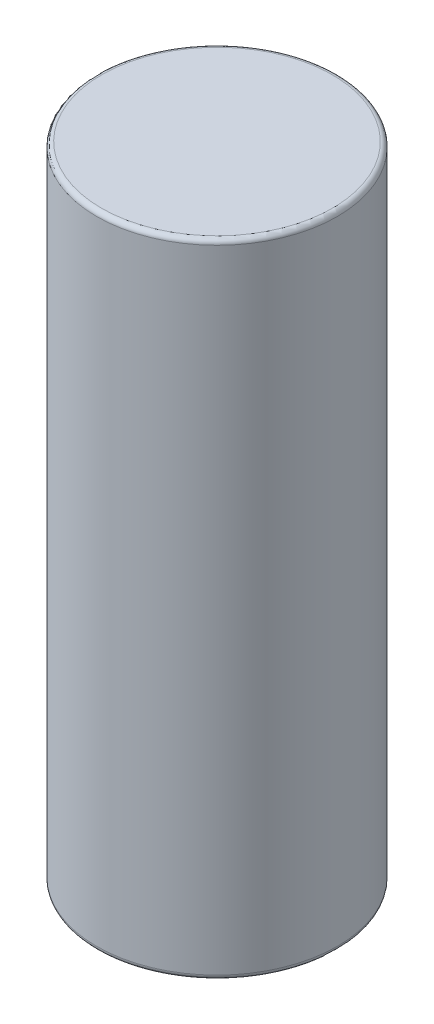
ISO-10303-21;
HEADER;
FILE_DESCRIPTION(('STEP AP214'),'2;1');
FILE_NAME('part.step','',(''),(''),'','','');
FILE_SCHEMA(('AUTOMOTIVE_DESIGN { 1 0 10303 214 1 1 1 1 }'));
ENDSEC;
DATA;
#1=APPLICATION_CONTEXT('core data for automotive mechanical design processes');
#2=APPLICATION_PROTOCOL_DEFINITION('international standard','automotive_design',2000,#1);
#3=PRODUCT_CONTEXT('',#1,'mechanical');
#4=PRODUCT('Part','Part','',(#3));
#5=PRODUCT_RELATED_PRODUCT_CATEGORY('part','',(#4));
#6=PRODUCT_DEFINITION_FORMATION('','',#4);
#7=PRODUCT_DEFINITION_CONTEXT('part definition',#1,'design');
#8=PRODUCT_DEFINITION('design','',#6,#7);
#9=PRODUCT_DEFINITION_SHAPE('','',#8);
#10=(LENGTH_UNIT() NAMED_UNIT(*) SI_UNIT(.MILLI.,.METRE.));
#11=(NAMED_UNIT(*) PLANE_ANGLE_UNIT() SI_UNIT($,.RADIAN.));
#12=(NAMED_UNIT(*) SI_UNIT($,.STERADIAN.) SOLID_ANGLE_UNIT());
#13=UNCERTAINTY_MEASURE_WITH_UNIT(LENGTH_MEASURE(1.E-05),#10,'distance_accuracy_value','');
#14=(GEOMETRIC_REPRESENTATION_CONTEXT(3) GLOBAL_UNCERTAINTY_ASSIGNED_CONTEXT((#13)) GLOBAL_UNIT_ASSIGNED_CONTEXT((#10,
#11,#12)) REPRESENTATION_CONTEXT('',''));
#15=CARTESIAN_POINT('',(0.,0.,0.));
#16=DIRECTION('',(0.,0.,1.));
#17=DIRECTION('',(1.,0.,0.));
#18=AXIS2_PLACEMENT_3D('',#15,#16,#17);
#19=CARTESIAN_POINT('',(0.,0.,0.));
#20=DIRECTION('',(0.,-1.,0.));
#21=DIRECTION('',(0.,0.,-1.));
#22=AXIS2_PLACEMENT_3D('',#19,#20,#21);
#23=CYLINDRICAL_SURFACE('',#22,75.);
#24=CARTESIAN_POINT('',(0.,-197.,0.));
#25=DIRECTION('',(0.,-1.,0.));
#26=DIRECTION('',(0.,0.,-1.));
#27=AXIS2_PLACEMENT_3D('',#24,#25,#26);
#28=CIRCLE('',#27,75.);
#29=CARTESIAN_POINT('',(0.,-197.,-75.));
#30=VERTEX_POINT('',#29);
#31=EDGE_CURVE('E42',#30,#30,#28,.F.);
#32=ORIENTED_EDGE('',*,*,#31,.T.);
#33=EDGE_LOOP('',(#32));
#34=FACE_BOUND('',#33,.T.);
#35=CARTESIAN_POINT('',(0.,197.,0.));
#36=DIRECTION('',(0.,1.,0.));
#37=DIRECTION('',(0.,0.,1.));
#38=AXIS2_PLACEMENT_3D('',#35,#36,#37);
#39=CIRCLE('',#38,75.);
#40=CARTESIAN_POINT('',(0.,197.,75.));
#41=VERTEX_POINT('',#40);
#42=EDGE_CURVE('E46',#41,#41,#39,.F.);
#43=ORIENTED_EDGE('',*,*,#42,.T.);
#44=EDGE_LOOP('',(#43));
#45=FACE_BOUND('',#44,.T.);
#46=ADVANCED_FACE('F35',(#34,#45),#23,.T.);
#47=CARTESIAN_POINT('',(0.,-200.,0.));
#48=DIRECTION('',(0.,-1.,0.));
#49=DIRECTION('',(0.,0.,-1.));
#50=AXIS2_PLACEMENT_3D('',#47,#48,#49);
#51=PLANE('',#50);
#52=CARTESIAN_POINT('',(0.,-200.,0.));
#53=DIRECTION('',(0.,-1.,0.));
#54=DIRECTION('',(0.,0.,-1.));
#55=AXIS2_PLACEMENT_3D('',#52,#53,#54);
#56=CIRCLE('',#55,72.);
#57=CARTESIAN_POINT('',(0.,-200.,-72.));
#58=VERTEX_POINT('',#57);
#59=EDGE_CURVE('E50',#58,#58,#56,.T.);
#60=ORIENTED_EDGE('',*,*,#59,.T.);
#61=EDGE_LOOP('',(#60));
#62=FACE_BOUND('',#61,.T.);
#63=ADVANCED_FACE('F56',(#62),#51,.T.);
#64=CARTESIAN_POINT('',(0.,200.,0.));
#65=DIRECTION('',(0.,1.,0.));
#66=DIRECTION('',(0.,0.,1.));
#67=AXIS2_PLACEMENT_3D('',#64,#65,#66);
#68=PLANE('',#67);
#69=CARTESIAN_POINT('',(0.,200.,0.));
#70=DIRECTION('',(0.,1.,0.));
#71=DIRECTION('',(0.,0.,1.));
#72=AXIS2_PLACEMENT_3D('',#69,#70,#71);
#73=CIRCLE('',#72,72.);
#74=CARTESIAN_POINT('',(0.,200.,72.));
#75=VERTEX_POINT('',#74);
#76=EDGE_CURVE('E10',#75,#75,#73,.T.);
#77=ORIENTED_EDGE('',*,*,#76,.T.);
#78=EDGE_LOOP('',(#77));
#79=FACE_BOUND('',#78,.T.);
#80=ADVANCED_FACE('F60',(#79),#68,.T.);
#81=CARTESIAN_POINT('',(0.,-197.,0.));
#82=DIRECTION('',(0.,-1.,0.));
#83=DIRECTION('',(0.,0.,-1.));
#84=AXIS2_PLACEMENT_3D('',#81,#82,#83);
#85=TOROIDAL_SURFACE('',#84,72.,3.);
#86=ORIENTED_EDGE('',*,*,#31,.F.);
#87=EDGE_LOOP('',(#86));
#88=FACE_BOUND('',#87,.T.);
#89=ORIENTED_EDGE('',*,*,#59,.F.);
#90=EDGE_LOOP('',(#89));
#91=FACE_BOUND('',#90,.T.);
#92=ADVANCED_FACE('F58',(#88,#91),#85,.T.);
#93=CARTESIAN_POINT('',(0.,197.,0.));
#94=DIRECTION('',(0.,1.,0.));
#95=DIRECTION('',(0.,0.,1.));
#96=AXIS2_PLACEMENT_3D('',#93,#94,#95);
#97=TOROIDAL_SURFACE('',#96,72.,3.);
#98=ORIENTED_EDGE('',*,*,#76,.F.);
#99=EDGE_LOOP('',(#98));
#100=FACE_BOUND('',#99,.T.);
#101=ORIENTED_EDGE('',*,*,#42,.F.);
#102=EDGE_LOOP('',(#101));
#103=FACE_BOUND('',#102,.T.);
#104=ADVANCED_FACE('F37',(#100,#103),#97,.T.);
#105=CLOSED_SHELL('',(#46,#63,#80,#92,#104));
#106=MANIFOLD_SOLID_BREP('B2',#105);
#107=ADVANCED_BREP_SHAPE_REPRESENTATION('',(#18,#106),#14);
#108=SHAPE_DEFINITION_REPRESENTATION(#9,#107);
ENDSEC;
END-ISO-10303-21;
